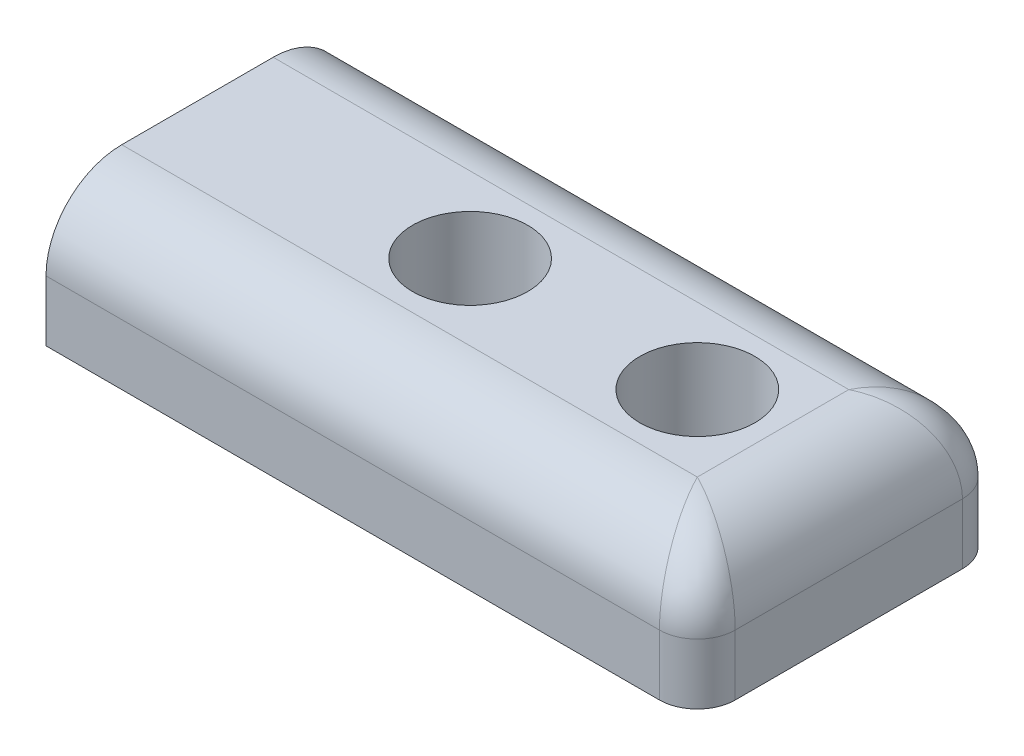
ISO-10303-21;
HEADER;
FILE_DESCRIPTION(('STEP AP214'),'2;1');
FILE_NAME('part.step','',(''),(''),'','','');
FILE_SCHEMA(('AUTOMOTIVE_DESIGN { 1 0 10303 214 1 1 1 1 }'));
ENDSEC;
DATA;
#1=APPLICATION_CONTEXT('core data for automotive mechanical design processes');
#2=APPLICATION_PROTOCOL_DEFINITION('international standard','automotive_design',2000,#1);
#3=PRODUCT_CONTEXT('',#1,'mechanical');
#4=PRODUCT('Part','Part','',(#3));
#5=PRODUCT_RELATED_PRODUCT_CATEGORY('part','',(#4));
#6=PRODUCT_DEFINITION_FORMATION('','',#4);
#7=PRODUCT_DEFINITION_CONTEXT('part definition',#1,'design');
#8=PRODUCT_DEFINITION('design','',#6,#7);
#9=PRODUCT_DEFINITION_SHAPE('','',#8);
#10=(LENGTH_UNIT() NAMED_UNIT(*) SI_UNIT(.MILLI.,.METRE.));
#11=(NAMED_UNIT(*) PLANE_ANGLE_UNIT() SI_UNIT($,.RADIAN.));
#12=(NAMED_UNIT(*) SI_UNIT($,.STERADIAN.) SOLID_ANGLE_UNIT());
#13=UNCERTAINTY_MEASURE_WITH_UNIT(LENGTH_MEASURE(1.E-05),#10,'distance_accuracy_value','');
#14=(GEOMETRIC_REPRESENTATION_CONTEXT(3) GLOBAL_UNCERTAINTY_ASSIGNED_CONTEXT((#13)) GLOBAL_UNIT_ASSIGNED_CONTEXT((#10,
#11,#12)) REPRESENTATION_CONTEXT('',''));
#15=CARTESIAN_POINT('',(0.,0.,0.));
#16=DIRECTION('',(0.,0.,1.));
#17=DIRECTION('',(1.,0.,0.));
#18=AXIS2_PLACEMENT_3D('',#15,#16,#17);
#19=CARTESIAN_POINT('',(10.75,4.5,-5.));
#20=DIRECTION('',(-1.,0.,0.));
#21=DIRECTION('',(0.,0.,1.));
#22=AXIS2_PLACEMENT_3D('',#19,#20,#21);
#23=PLANE('',#22);
#24=DIRECTION('',(0.,0.,-1.));
#25=VECTOR('',#24,1.);
#26=CARTESIAN_POINT('',(10.75,0.,-5.));
#27=LINE('',#26,#25);
#28=CARTESIAN_POINT('',(10.75,0.,3.75));
#29=VERTEX_POINT('',#28);
#30=CARTESIAN_POINT('',(10.75,0.,-3.75));
#31=VERTEX_POINT('',#30);
#32=EDGE_CURVE('E169',#29,#31,#27,.T.);
#33=ORIENTED_EDGE('',*,*,#32,.T.);
#34=DIRECTION('',(0.,-1.,0.));
#35=VECTOR('',#34,1.);
#36=CARTESIAN_POINT('',(10.75,4.5,-3.75));
#37=LINE('',#36,#35);
#38=CARTESIAN_POINT('',(10.75,2.,-3.75));
#39=VERTEX_POINT('',#38);
#40=EDGE_CURVE('E227',#31,#39,#37,.F.);
#41=ORIENTED_EDGE('',*,*,#40,.T.);
#42=DIRECTION('',(0.,0.,-1.));
#43=VECTOR('',#42,1.);
#44=CARTESIAN_POINT('',(10.75,2.,5.));
#45=LINE('',#44,#43);
#46=CARTESIAN_POINT('',(10.75,2.,3.75));
#47=VERTEX_POINT('',#46);
#48=EDGE_CURVE('E197',#39,#47,#45,.F.);
#49=ORIENTED_EDGE('',*,*,#48,.T.);
#50=DIRECTION('',(0.,-1.,0.));
#51=VECTOR('',#50,1.);
#52=CARTESIAN_POINT('',(10.75,4.5,3.75));
#53=LINE('',#52,#51);
#54=EDGE_CURVE('E223',#47,#29,#53,.T.);
#55=ORIENTED_EDGE('',*,*,#54,.T.);
#56=EDGE_LOOP('',(#33,#41,#49,#55));
#57=FACE_BOUND('',#56,.T.);
#58=ADVANCED_FACE('F47',(#57),#23,.F.);
#59=CARTESIAN_POINT('',(-10.75,4.5,-5.));
#60=DIRECTION('',(0.,0.,1.));
#61=DIRECTION('',(1.,0.,0.));
#62=AXIS2_PLACEMENT_3D('',#59,#60,#61);
#63=PLANE('',#62);
#64=DIRECTION('',(-1.,0.,0.));
#65=VECTOR('',#64,1.);
#66=CARTESIAN_POINT('',(10.75,2.,-5.));
#67=LINE('',#66,#65);
#68=CARTESIAN_POINT('',(-10.75,2.,-5.));
#69=VERTEX_POINT('',#68);
#70=CARTESIAN_POINT('',(9.5,2.,-5.));
#71=VERTEX_POINT('',#70);
#72=EDGE_CURVE('E206',#69,#71,#67,.F.);
#73=ORIENTED_EDGE('',*,*,#72,.T.);
#74=DIRECTION('',(0.,-1.,0.));
#75=VECTOR('',#74,1.);
#76=CARTESIAN_POINT('',(9.5,4.5,-5.));
#77=LINE('',#76,#75);
#78=CARTESIAN_POINT('',(9.5,0.,-5.));
#79=VERTEX_POINT('',#78);
#80=EDGE_CURVE('E213',#71,#79,#77,.T.);
#81=ORIENTED_EDGE('',*,*,#80,.T.);
#82=DIRECTION('',(-1.,0.,0.));
#83=VECTOR('',#82,1.);
#84=CARTESIAN_POINT('',(-10.75,0.,-5.));
#85=LINE('',#84,#83);
#86=CARTESIAN_POINT('',(-10.75,0.,-5.));
#87=VERTEX_POINT('',#86);
#88=EDGE_CURVE('E165',#79,#87,#85,.T.);
#89=ORIENTED_EDGE('',*,*,#88,.T.);
#90=DIRECTION('',(0.,-1.,0.));
#91=VECTOR('',#90,1.);
#92=CARTESIAN_POINT('',(-10.75,4.5,-5.));
#93=LINE('',#92,#91);
#94=EDGE_CURVE('E179',#69,#87,#93,.T.);
#95=ORIENTED_EDGE('',*,*,#94,.F.);
#96=EDGE_LOOP('',(#73,#81,#89,#95));
#97=FACE_BOUND('',#96,.T.);
#98=ADVANCED_FACE('F273',(#97),#63,.F.);
#99=CARTESIAN_POINT('',(-10.75,4.5,-5.));
#100=DIRECTION('',(1.,0.,0.));
#101=DIRECTION('',(0.,0.,-1.));
#102=AXIS2_PLACEMENT_3D('',#99,#100,#101);
#103=PLANE('',#102);
#104=DIRECTION('',(0.,0.,1.));
#105=VECTOR('',#104,1.);
#106=CARTESIAN_POINT('',(-10.75,4.5,-5.));
#107=LINE('',#106,#105);
#108=CARTESIAN_POINT('',(-10.75,4.5,-2.5));
#109=VERTEX_POINT('',#108);
#110=CARTESIAN_POINT('',(-10.75,4.5,2.5));
#111=VERTEX_POINT('',#110);
#112=EDGE_CURVE('E175',#109,#111,#107,.T.);
#113=ORIENTED_EDGE('',*,*,#112,.F.);
#114=CARTESIAN_POINT('',(-10.75,2.,-2.5));
#115=DIRECTION('',(1.,0.,0.));
#116=DIRECTION('',(0.,0.,-1.));
#117=AXIS2_PLACEMENT_3D('',#114,#115,#116);
#118=CIRCLE('',#117,2.5);
#119=EDGE_CURVE('E203',#109,#69,#118,.F.);
#120=ORIENTED_EDGE('',*,*,#119,.T.);
#121=ORIENTED_EDGE('',*,*,#94,.T.);
#122=DIRECTION('',(0.,0.,1.));
#123=VECTOR('',#122,1.);
#124=CARTESIAN_POINT('',(-10.75,0.,-5.));
#125=LINE('',#124,#123);
#126=CARTESIAN_POINT('',(-10.75,0.,-3.95));
#127=VERTEX_POINT('',#126);
#128=EDGE_CURVE('E157',#87,#127,#125,.T.);
#129=ORIENTED_EDGE('',*,*,#128,.T.);
#130=CARTESIAN_POINT('',(-10.75,0.,0.));
#131=DIRECTION('',(-1.,0.,0.));
#132=DIRECTION('',(0.,0.,1.));
#133=AXIS2_PLACEMENT_3D('',#130,#131,#132);
#134=CIRCLE('',#133,3.95);
#135=CARTESIAN_POINT('',(-10.75,0.,3.95));
#136=VERTEX_POINT('',#135);
#137=EDGE_CURVE('E137',#136,#127,#134,.T.);
#138=ORIENTED_EDGE('',*,*,#137,.F.);
#139=CARTESIAN_POINT('',(-10.75,0.,5.));
#140=VERTEX_POINT('',#139);
#141=EDGE_CURVE('E153',#136,#140,#125,.T.);
#142=ORIENTED_EDGE('',*,*,#141,.T.);
#143=DIRECTION('',(0.,-1.,0.));
#144=VECTOR('',#143,1.);
#145=CARTESIAN_POINT('',(-10.75,4.5,5.));
#146=LINE('',#145,#144);
#147=CARTESIAN_POINT('',(-10.75,2.,5.));
#148=VERTEX_POINT('',#147);
#149=EDGE_CURVE('E176',#148,#140,#146,.T.);
#150=ORIENTED_EDGE('',*,*,#149,.F.);
#151=CARTESIAN_POINT('',(-10.75,2.,2.5));
#152=DIRECTION('',(1.,0.,0.));
#153=DIRECTION('',(0.,0.,-1.));
#154=AXIS2_PLACEMENT_3D('',#151,#152,#153);
#155=CIRCLE('',#154,2.5);
#156=EDGE_CURVE('E200',#148,#111,#155,.F.);
#157=ORIENTED_EDGE('',*,*,#156,.T.);
#158=EDGE_LOOP('',(#113,#120,#121,#129,#138,#142,#150,#157));
#159=FACE_BOUND('',#158,.T.);
#160=ADVANCED_FACE('F151',(#159),#103,.F.);
#161=CARTESIAN_POINT('',(-10.75,4.5,5.));
#162=DIRECTION('',(0.,0.,-1.));
#163=DIRECTION('',(-1.,0.,0.));
#164=AXIS2_PLACEMENT_3D('',#161,#162,#163);
#165=PLANE('',#164);
#166=DIRECTION('',(1.,0.,0.));
#167=VECTOR('',#166,1.);
#168=CARTESIAN_POINT('',(-10.75,0.,5.));
#169=LINE('',#168,#167);
#170=CARTESIAN_POINT('',(9.5,0.,5.));
#171=VERTEX_POINT('',#170);
#172=EDGE_CURVE('E163',#140,#171,#169,.T.);
#173=ORIENTED_EDGE('',*,*,#172,.T.);
#174=DIRECTION('',(0.,-1.,0.));
#175=VECTOR('',#174,1.);
#176=CARTESIAN_POINT('',(9.5,4.5,5.));
#177=LINE('',#176,#175);
#178=CARTESIAN_POINT('',(9.5,2.,5.));
#179=VERTEX_POINT('',#178);
#180=EDGE_CURVE('E69',#171,#179,#177,.F.);
#181=ORIENTED_EDGE('',*,*,#180,.T.);
#182=DIRECTION('',(1.,0.,0.));
#183=VECTOR('',#182,1.);
#184=CARTESIAN_POINT('',(-10.75,2.,5.));
#185=LINE('',#184,#183);
#186=EDGE_CURVE('E210',#179,#148,#185,.F.);
#187=ORIENTED_EDGE('',*,*,#186,.T.);
#188=ORIENTED_EDGE('',*,*,#149,.T.);
#189=EDGE_LOOP('',(#173,#181,#187,#188));
#190=FACE_BOUND('',#189,.T.);
#191=ADVANCED_FACE('F284',(#190),#165,.F.);
#192=CARTESIAN_POINT('',(0.,4.5,0.));
#193=DIRECTION('',(0.,1.,0.));
#194=DIRECTION('',(0.,0.,1.));
#195=AXIS2_PLACEMENT_3D('',#192,#193,#194);
#196=PLANE('',#195);
#197=CARTESIAN_POINT('',(-1.75,4.5,0.));
#198=DIRECTION('',(0.,1.,0.));
#199=DIRECTION('',(0.,0.,1.));
#200=AXIS2_PLACEMENT_3D('',#197,#198,#199);
#201=CIRCLE('',#200,1.9);
#202=CARTESIAN_POINT('',(-1.75,4.5,1.9));
#203=VERTEX_POINT('',#202);
#204=EDGE_CURVE('E420',#203,#203,#201,.T.);
#205=ORIENTED_EDGE('',*,*,#204,.F.);
#206=EDGE_LOOP('',(#205));
#207=FACE_BOUND('',#206,.T.);
#208=CARTESIAN_POINT('',(5.75,4.5,0.));
#209=DIRECTION('',(0.,1.,0.));
#210=DIRECTION('',(0.,0.,1.));
#211=AXIS2_PLACEMENT_3D('',#208,#209,#210);
#212=CIRCLE('',#211,1.9);
#213=CARTESIAN_POINT('',(5.75,4.5,1.9));
#214=VERTEX_POINT('',#213);
#215=EDGE_CURVE('E416',#214,#214,#212,.T.);
#216=ORIENTED_EDGE('',*,*,#215,.F.);
#217=EDGE_LOOP('',(#216));
#218=FACE_BOUND('',#217,.T.);
#219=DIRECTION('',(0.,0.,-1.));
#220=VECTOR('',#219,1.);
#221=CARTESIAN_POINT('',(8.25,4.5,-5.));
#222=LINE('',#221,#220);
#223=CARTESIAN_POINT('',(8.25,4.5,2.5));
#224=VERTEX_POINT('',#223);
#225=CARTESIAN_POINT('',(8.25,4.5,-2.5));
#226=VERTEX_POINT('',#225);
#227=EDGE_CURVE('E190',#224,#226,#222,.T.);
#228=ORIENTED_EDGE('',*,*,#227,.T.);
#229=DIRECTION('',(-1.,0.,0.));
#230=VECTOR('',#229,1.);
#231=CARTESIAN_POINT('',(-10.75,4.5,-2.5));
#232=LINE('',#231,#230);
#233=EDGE_CURVE('E194',#226,#109,#232,.T.);
#234=ORIENTED_EDGE('',*,*,#233,.T.);
#235=ORIENTED_EDGE('',*,*,#112,.T.);
#236=DIRECTION('',(1.,0.,0.));
#237=VECTOR('',#236,1.);
#238=CARTESIAN_POINT('',(10.75,4.5,2.5));
#239=LINE('',#238,#237);
#240=EDGE_CURVE('E186',#111,#224,#239,.T.);
#241=ORIENTED_EDGE('',*,*,#240,.T.);
#242=EDGE_LOOP('',(#228,#234,#235,#241));
#243=FACE_BOUND('',#242,.T.);
#244=ADVANCED_FACE('F287',(#207,#218,#243),#196,.T.);
#245=CARTESIAN_POINT('',(0.,0.,0.));
#246=DIRECTION('',(0.,1.,0.));
#247=DIRECTION('',(0.,0.,1.));
#248=AXIS2_PLACEMENT_3D('',#245,#246,#247);
#249=PLANE('',#248);
#250=CARTESIAN_POINT('',(-1.75,0.,0.));
#251=DIRECTION('',(0.,1.,0.));
#252=DIRECTION('',(0.,0.,1.));
#253=AXIS2_PLACEMENT_3D('',#250,#251,#252);
#254=CIRCLE('',#253,1.9);
#255=CARTESIAN_POINT('',(-1.75,0.,1.9));
#256=VERTEX_POINT('',#255);
#257=EDGE_CURVE('E424',#256,#256,#254,.T.);
#258=ORIENTED_EDGE('',*,*,#257,.T.);
#259=EDGE_LOOP('',(#258));
#260=FACE_BOUND('',#259,.T.);
#261=CARTESIAN_POINT('',(5.75,0.,0.));
#262=DIRECTION('',(0.,1.,0.));
#263=DIRECTION('',(0.,0.,1.));
#264=AXIS2_PLACEMENT_3D('',#261,#262,#263);
#265=CIRCLE('',#264,1.9);
#266=CARTESIAN_POINT('',(5.75,0.,1.9));
#267=VERTEX_POINT('',#266);
#268=EDGE_CURVE('E412',#267,#267,#265,.T.);
#269=ORIENTED_EDGE('',*,*,#268,.T.);
#270=EDGE_LOOP('',(#269));
#271=FACE_BOUND('',#270,.T.);
#272=ORIENTED_EDGE('',*,*,#88,.F.);
#273=CARTESIAN_POINT('',(9.5,0.,-3.75));
#274=DIRECTION('',(0.,1.,0.));
#275=DIRECTION('',(0.,0.,1.));
#276=AXIS2_PLACEMENT_3D('',#273,#274,#275);
#277=CIRCLE('',#276,1.25);
#278=EDGE_CURVE('E220',#79,#31,#277,.F.);
#279=ORIENTED_EDGE('',*,*,#278,.T.);
#280=ORIENTED_EDGE('',*,*,#32,.F.);
#281=CARTESIAN_POINT('',(9.5,0.,3.75));
#282=DIRECTION('',(0.,1.,0.));
#283=DIRECTION('',(0.,0.,1.));
#284=AXIS2_PLACEMENT_3D('',#281,#282,#283);
#285=CIRCLE('',#284,1.25);
#286=EDGE_CURVE('E217',#29,#171,#285,.F.);
#287=ORIENTED_EDGE('',*,*,#286,.T.);
#288=ORIENTED_EDGE('',*,*,#172,.F.);
#289=ORIENTED_EDGE('',*,*,#141,.F.);
#290=DIRECTION('',(-1.,0.,0.));
#291=VECTOR('',#290,1.);
#292=CARTESIAN_POINT('',(-6.65,0.,3.95));
#293=LINE('',#292,#291);
#294=CARTESIAN_POINT('',(-6.65,0.,3.95));
#295=VERTEX_POINT('',#294);
#296=EDGE_CURVE('E133',#136,#295,#293,.F.);
#297=ORIENTED_EDGE('',*,*,#296,.T.);
#298=DIRECTION('',(0.,0.,1.));
#299=VECTOR('',#298,1.);
#300=CARTESIAN_POINT('',(-6.65,0.,0.));
#301=LINE('',#300,#299);
#302=CARTESIAN_POINT('',(-6.65,0.,-3.95));
#303=VERTEX_POINT('',#302);
#304=EDGE_CURVE('E145',#303,#295,#301,.T.);
#305=ORIENTED_EDGE('',*,*,#304,.F.);
#306=DIRECTION('',(-1.,0.,0.));
#307=VECTOR('',#306,1.);
#308=CARTESIAN_POINT('',(-6.65,0.,-3.95));
#309=LINE('',#308,#307);
#310=EDGE_CURVE('E144',#303,#127,#309,.T.);
#311=ORIENTED_EDGE('',*,*,#310,.T.);
#312=ORIENTED_EDGE('',*,*,#128,.F.);
#313=EDGE_LOOP('',(#272,#279,#280,#287,#288,#289,#297,#305,#311,#312));
#314=FACE_BOUND('',#313,.T.);
#315=ADVANCED_FACE('F162',(#260,#271,#314),#249,.F.);
#316=CARTESIAN_POINT('',(5.75,0.,0.));
#317=DIRECTION('',(0.,1.,0.));
#318=DIRECTION('',(0.,0.,1.));
#319=AXIS2_PLACEMENT_3D('',#316,#317,#318);
#320=CYLINDRICAL_SURFACE('',#319,1.9);
#321=ORIENTED_EDGE('',*,*,#268,.F.);
#322=EDGE_LOOP('',(#321));
#323=FACE_BOUND('',#322,.T.);
#324=ORIENTED_EDGE('',*,*,#215,.T.);
#325=EDGE_LOOP('',(#324));
#326=FACE_BOUND('',#325,.T.);
#327=ADVANCED_FACE('F289',(#323,#326),#320,.F.);
#328=CARTESIAN_POINT('',(-1.75,0.,0.));
#329=DIRECTION('',(0.,1.,0.));
#330=DIRECTION('',(0.,0.,1.));
#331=AXIS2_PLACEMENT_3D('',#328,#329,#330);
#332=CYLINDRICAL_SURFACE('',#331,1.9);
#333=ORIENTED_EDGE('',*,*,#257,.F.);
#334=EDGE_LOOP('',(#333));
#335=FACE_BOUND('',#334,.T.);
#336=ORIENTED_EDGE('',*,*,#204,.T.);
#337=EDGE_LOOP('',(#336));
#338=FACE_BOUND('',#337,.T.);
#339=ADVANCED_FACE('F296',(#335,#338),#332,.F.);
#340=CARTESIAN_POINT('',(-6.65,0.,0.));
#341=DIRECTION('',(-1.,0.,0.));
#342=DIRECTION('',(0.,0.,1.));
#343=AXIS2_PLACEMENT_3D('',#340,#341,#342);
#344=CYLINDRICAL_SURFACE('',#343,3.95);
#345=CARTESIAN_POINT('',(-6.65,0.,0.));
#346=DIRECTION('',(-1.,0.,0.));
#347=DIRECTION('',(0.,0.,1.));
#348=AXIS2_PLACEMENT_3D('',#345,#346,#347);
#349=CIRCLE('',#348,3.95);
#350=EDGE_CURVE('E139',#295,#303,#349,.T.);
#351=ORIENTED_EDGE('',*,*,#350,.F.);
#352=ORIENTED_EDGE('',*,*,#296,.F.);
#353=ORIENTED_EDGE('',*,*,#137,.T.);
#354=ORIENTED_EDGE('',*,*,#310,.F.);
#355=EDGE_LOOP('',(#351,#352,#353,#354));
#356=FACE_BOUND('',#355,.T.);
#357=ADVANCED_FACE('F135',(#356),#344,.F.);
#358=CARTESIAN_POINT('',(-6.65,0.,0.));
#359=DIRECTION('',(-1.,0.,0.));
#360=DIRECTION('',(0.,0.,1.));
#361=AXIS2_PLACEMENT_3D('',#358,#359,#360);
#362=PLANE('',#361);
#363=ORIENTED_EDGE('',*,*,#304,.T.);
#364=ORIENTED_EDGE('',*,*,#350,.T.);
#365=EDGE_LOOP('',(#363,#364));
#366=FACE_BOUND('',#365,.T.);
#367=ADVANCED_FACE('F264',(#366),#362,.T.);
#368=CARTESIAN_POINT('',(0.,2.,2.5));
#369=DIRECTION('',(-1.,0.,0.));
#370=DIRECTION('',(0.,0.,1.));
#371=AXIS2_PLACEMENT_3D('',#368,#369,#370);
#372=CYLINDRICAL_SURFACE('',#371,2.5);
#373=ORIENTED_EDGE('',*,*,#186,.F.);
#374=CARTESIAN_POINT('',(8.25,2.,2.5));
#375=DIRECTION('',(0.894427190999916,0.,-0.447213595499958));
#376=DIRECTION('',(0.447213595499958,0.,0.894427190999916));
#377=AXIS2_PLACEMENT_3D('',#374,#375,#376);
#378=ELLIPSE('',#377,2.79508497187474,2.5);
#379=EDGE_CURVE('E11',#179,#224,#378,.F.);
#380=ORIENTED_EDGE('',*,*,#379,.T.);
#381=ORIENTED_EDGE('',*,*,#240,.F.);
#382=ORIENTED_EDGE('',*,*,#156,.F.);
#383=EDGE_LOOP('',(#373,#380,#381,#382));
#384=FACE_BOUND('',#383,.T.);
#385=ADVANCED_FACE('F260',(#384),#372,.T.);
#386=CARTESIAN_POINT('',(0.,2.,-2.5));
#387=DIRECTION('',(1.,0.,0.));
#388=DIRECTION('',(0.,0.,-1.));
#389=AXIS2_PLACEMENT_3D('',#386,#387,#388);
#390=CYLINDRICAL_SURFACE('',#389,2.5);
#391=ORIENTED_EDGE('',*,*,#233,.F.);
#392=CARTESIAN_POINT('',(8.25,2.,-2.5));
#393=DIRECTION('',(-0.894427190999916,0.,-0.447213595499958));
#394=DIRECTION('',(-0.447213595499958,0.,0.894427190999916));
#395=AXIS2_PLACEMENT_3D('',#392,#393,#394);
#396=ELLIPSE('',#395,2.79508497187474,2.5);
#397=EDGE_CURVE('E61',#226,#71,#396,.T.);
#398=ORIENTED_EDGE('',*,*,#397,.T.);
#399=ORIENTED_EDGE('',*,*,#72,.F.);
#400=ORIENTED_EDGE('',*,*,#119,.F.);
#401=EDGE_LOOP('',(#391,#398,#399,#400));
#402=FACE_BOUND('',#401,.T.);
#403=ADVANCED_FACE('F257',(#402),#390,.T.);
#404=CARTESIAN_POINT('',(8.25,2.,0.));
#405=DIRECTION('',(0.,0.,1.));
#406=DIRECTION('',(1.,0.,0.));
#407=AXIS2_PLACEMENT_3D('',#404,#405,#406);
#408=CYLINDRICAL_SURFACE('',#407,2.5);
#409=ORIENTED_EDGE('',*,*,#48,.F.);
#410=CARTESIAN_POINT('',(8.25,2.,-2.5));
#411=DIRECTION('',(-0.447213595499958,0.,-0.894427190999916));
#412=DIRECTION('',(-0.894427190999916,0.,0.447213595499958));
#413=AXIS2_PLACEMENT_3D('',#410,#411,#412);
#414=ELLIPSE('',#413,2.79508497187474,2.5);
#415=EDGE_CURVE('E234',#39,#226,#414,.F.);
#416=ORIENTED_EDGE('',*,*,#415,.T.);
#417=ORIENTED_EDGE('',*,*,#227,.F.);
#418=CARTESIAN_POINT('',(8.25,2.,2.5));
#419=DIRECTION('',(0.447213595499958,0.,-0.894427190999916));
#420=DIRECTION('',(0.894427190999916,0.,0.447213595499958));
#421=AXIS2_PLACEMENT_3D('',#418,#419,#420);
#422=ELLIPSE('',#421,2.79508497187474,2.5);
#423=EDGE_CURVE('E77',#224,#47,#422,.T.);
#424=ORIENTED_EDGE('',*,*,#423,.T.);
#425=EDGE_LOOP('',(#409,#416,#417,#424));
#426=FACE_BOUND('',#425,.T.);
#427=ADVANCED_FACE('F252',(#426),#408,.T.);
#428=CARTESIAN_POINT('',(8.25,-0.5,-2.5));
#429=CARTESIAN_POINT('',(8.25,-0.5,-2.5));
#430=CARTESIAN_POINT('',(8.25,-0.5,-2.5));
#431=CARTESIAN_POINT('',(8.30445593387974,-0.499956180937483,-2.60891186775949));
#432=CARTESIAN_POINT('',(8.33169932417916,-0.499971633795231,-2.58169932417916));
#433=CARTESIAN_POINT('',(8.35891186775949,-0.499956180937482,-2.55445593387974));
#434=CARTESIAN_POINT('',(8.35892577223853,-0.492879390711457,-2.71785154447707));
#435=CARTESIAN_POINT('',(8.41362492956338,-0.49643279621389,-2.66362492956338));
#436=CARTESIAN_POINT('',(8.46785154447707,-0.492879390711457,-2.60892577223853));
#437=CARTESIAN_POINT('',(8.46692874242023,-0.464466186138877,-2.93385748484046));
#438=CARTESIAN_POINT('',(8.57701759048618,-0.48210746818504,-2.82701759048618));
#439=CARTESIAN_POINT('',(8.68385748484046,-0.464466186138877,-2.71692874242023));
#440=CARTESIAN_POINT('',(8.52046590080171,-0.44325148834774,-3.04093180160343));
#441=CARTESIAN_POINT('',(8.65894806211635,-0.471301059765046,-2.90894806211635));
#442=CARTESIAN_POINT('',(8.79093180160343,-0.44325148834774,-2.77046590080171));
#443=CARTESIAN_POINT('',(8.62569177412273,-0.386854614304637,-3.25138354824547));
#444=CARTESIAN_POINT('',(8.82237361965901,-0.44209433172581,-3.07237361965901));
#445=CARTESIAN_POINT('',(9.00138354824547,-0.386854614304636,-2.87569177412274));
#446=CARTESIAN_POINT('',(8.67739643120403,-0.351912682305615,-3.35479286240807));
#447=CARTESIAN_POINT('',(8.90432614054108,-0.423655382726429,-3.15432614054108));
#448=CARTESIAN_POINT('',(9.10479286240807,-0.351912682305614,-2.92739643120403));
#449=CARTESIAN_POINT('',(8.77805683373335,-0.268524892883583,-3.55611366746671));
#450=CARTESIAN_POINT('',(9.06785074699877,-0.37841643175925,-3.31785074699877));
#451=CARTESIAN_POINT('',(9.30611366746671,-0.268524892883582,-3.02805683373336));
#452=CARTESIAN_POINT('',(8.82704891980832,-0.220432901107066,-3.65409783961664));
#453=CARTESIAN_POINT('',(9.14986429227303,-0.351564233128582,-3.39986429227303));
#454=CARTESIAN_POINT('',(9.40409783961664,-0.220432901107066,-3.07704891980832));
#455=CARTESIAN_POINT('',(8.92142479417494,-0.111456529170347,-3.84284958834987));
#456=CARTESIAN_POINT('',(9.31353936797959,-0.288199051327867,-3.56353936797959));
#457=CARTESIAN_POINT('',(9.59284958834987,-0.111456529170346,-3.17142479417494));
#458=CARTESIAN_POINT('',(8.96687379833891,-0.051028056117229,-3.93374759667782));
#459=CARTESIAN_POINT('',(9.39561231770866,-0.251631389224831,-3.64561231770866));
#460=CARTESIAN_POINT('',(9.68374759667782,-0.0510280561172274,-3.21687379833891));
#461=CARTESIAN_POINT('',(9.05335509580684,0.0816912934874319,-4.10671019161367));
#462=CARTESIAN_POINT('',(9.55925810726242,-0.166779927152644,-3.80925810726242));
#463=CARTESIAN_POINT('',(9.85671019161367,0.0816912934874333,-3.30335509580684));
#464=CARTESIAN_POINT('',(9.09448958953204,0.15344424644474,-4.18897917906409));
#465=CARTESIAN_POINT('',(9.64118996564893,-0.11846253387828,-3.89118996564893));
#466=CARTESIAN_POINT('',(9.93897917906409,0.15344424644474,-3.34448958953204));
#467=CARTESIAN_POINT('',(9.17159910034432,0.307665277703491,-4.34319820068864));
#468=CARTESIAN_POINT('',(9.80391164676731,-0.00713205513862803,-4.05391164676731));
#469=CARTESIAN_POINT('',(10.0931982006886,0.307665277703491,-3.42159910034432));
#470=CARTESIAN_POINT('',(9.20771926540998,0.389546641603582,-4.41543853081997));
#471=CARTESIAN_POINT('',(9.88497757651562,0.0558491217687662,-4.13497757651562));
#472=CARTESIAN_POINT('',(10.16543853082,0.389546641603583,-3.45771926540999));
#473=CARTESIAN_POINT('',(9.27413709166401,0.562666072959942,-4.54827418332802));
#474=CARTESIAN_POINT('',(10.0442931240796,0.200346345721282,-4.29429312407963));
#475=CARTESIAN_POINT('',(10.298274183328,0.562666072959944,-3.52413709166401));
#476=CARTESIAN_POINT('',(9.30462348850139,0.653318147654521,-4.60924697700278));
#477=CARTESIAN_POINT('',(10.1227009617604,0.281689197910976,-4.37270096176039));
#478=CARTESIAN_POINT('',(10.3592469770028,0.653318147654522,-3.55462348850139));
#479=CARTESIAN_POINT('',(9.35920747679134,0.842411982898301,-4.71841495358267));
#480=CARTESIAN_POINT('',(10.2732897090255,0.466928603444963,-4.52328970902553));
#481=CARTESIAN_POINT('',(10.4684149535827,0.842411982898302,-3.60920747679134));
#482=CARTESIAN_POINT('',(9.38352776144434,0.940332904635576,-4.76705552288868));
#483=CARTESIAN_POINT('',(10.3454841995717,0.570397720829993,-4.59548419957169));
#484=CARTESIAN_POINT('',(10.5170555228887,0.940332904635577,-3.63352776144434));
#485=CARTESIAN_POINT('',(9.42533157969453,1.14219618344742,-4.85066315938906));
#486=CARTESIAN_POINT('',(10.4779971962076,0.802361669332824,-4.72799719620756));
#487=CARTESIAN_POINT('',(10.6006631593891,1.14219618344742,-3.67533157969453));
#488=CARTESIAN_POINT('',(9.44304659288318,1.24574966302615,-4.88609318576637));
#489=CARTESIAN_POINT('',(10.5381907237899,0.930040324117443,-4.78819072378994));
#490=CARTESIAN_POINT('',(10.6360931857664,1.24574966302615,-3.69304659288318));
#491=CARTESIAN_POINT('',(9.47133677180838,1.45693619055351,-4.94267354361676));
#492=CARTESIAN_POINT('',(10.6393262696795,1.20866853883658,-4.88932626967951));
#493=CARTESIAN_POINT('',(10.6926735436168,1.45693619055351,-3.72133677180838));
#494=CARTESIAN_POINT('',(9.48211035038742,1.56435338065055,-4.96422070077484));
#495=CARTESIAN_POINT('',(10.680070581323,1.35831896876683,-4.93007058132305));
#496=CARTESIAN_POINT('',(10.7142207007748,1.56435338065055,-3.73211035038742));
#497=CARTESIAN_POINT('',(9.49638374561597,1.78122190556899,-4.99276749123193));
#498=CARTESIAN_POINT('',(10.7354827430434,1.67281564976531,-4.98548274304339));
#499=CARTESIAN_POINT('',(10.7427674912319,1.78122190556899,-3.74638374561597));
#500=CARTESIAN_POINT('',(9.5,1.8906109527845,-5.));
#501=CARTESIAN_POINT('',(10.75,1.83593044725813,-5.));
#502=CARTESIAN_POINT('',(10.75,1.8906109527845,-3.75));
#503=CARTESIAN_POINT('',(9.5,2.1093890472155,-5.));
#504=CARTESIAN_POINT('',(10.75,2.16406955274187,-5.));
#505=CARTESIAN_POINT('',(10.75,2.1093890472155,-3.75));
#506=CARTESIAN_POINT('',(9.49638374561597,2.21877809443101,-4.99276749123193));
#507=CARTESIAN_POINT('',(10.7354827430434,2.32718435023469,-4.98548274304339));
#508=CARTESIAN_POINT('',(10.7427674912319,2.21877809443101,-3.74638374561597));
#509=CARTESIAN_POINT('',(9.48211035038742,2.43564661934945,-4.96422070077484));
#510=CARTESIAN_POINT('',(10.680070581323,2.64168103123316,-4.93007058132304));
#511=CARTESIAN_POINT('',(10.7142207007748,2.43564661934945,-3.73211035038742));
#512=CARTESIAN_POINT('',(9.47133677180838,2.54306380944649,-4.94267354361676));
#513=CARTESIAN_POINT('',(10.6393262696795,2.79133146116342,-4.88932626967951));
#514=CARTESIAN_POINT('',(10.6926735436168,2.54306380944649,-3.72133677180838));
#515=CARTESIAN_POINT('',(9.44304659288318,2.75425033697385,-4.88609318576637));
#516=CARTESIAN_POINT('',(10.5381907237899,3.06995967588256,-4.78819072378994));
#517=CARTESIAN_POINT('',(10.6360931857664,2.75425033697385,-3.69304659288318));
#518=CARTESIAN_POINT('',(9.42533157969453,2.85780381655258,-4.85066315938906));
#519=CARTESIAN_POINT('',(10.4779971962076,3.19763833066717,-4.72799719620756));
#520=CARTESIAN_POINT('',(10.6006631593891,2.85780381655258,-3.67533157969453));
#521=CARTESIAN_POINT('',(9.38352776144434,3.05966709536442,-4.76705552288868));
#522=CARTESIAN_POINT('',(10.3454841995717,3.42960227917001,-4.5954841995717));
#523=CARTESIAN_POINT('',(10.5170555228887,3.05966709536442,-3.63352776144434));
#524=CARTESIAN_POINT('',(9.35920747679134,3.1575880171017,-4.71841495358267));
#525=CARTESIAN_POINT('',(10.2732897090255,3.53307139655504,-4.52328970902552));
#526=CARTESIAN_POINT('',(10.4684149535827,3.1575880171017,-3.60920747679134));
#527=CARTESIAN_POINT('',(9.30462348850139,3.34668185234548,-4.60924697700278));
#528=CARTESIAN_POINT('',(10.1227009617604,3.71831080208902,-4.37270096176039));
#529=CARTESIAN_POINT('',(10.3592469770028,3.34668185234548,-3.55462348850139));
#530=CARTESIAN_POINT('',(9.27413709166401,3.43733392704006,-4.54827418332803));
#531=CARTESIAN_POINT('',(10.0442931240796,3.79965365427872,-4.29429312407963));
#532=CARTESIAN_POINT('',(10.298274183328,3.43733392704006,-3.52413709166401));
#533=CARTESIAN_POINT('',(9.20771926540998,3.61045335839642,-4.41543853081998));
#534=CARTESIAN_POINT('',(9.88497757651562,3.94415087823123,-4.13497757651562));
#535=CARTESIAN_POINT('',(10.16543853082,3.61045335839641,-3.45771926540999));
#536=CARTESIAN_POINT('',(9.17159910034432,3.69233472229651,-4.34319820068864));
#537=CARTESIAN_POINT('',(9.80391164676731,4.00713205513863,-4.05391164676731));
#538=CARTESIAN_POINT('',(10.0931982006886,3.69233472229651,-3.42159910034432));
#539=CARTESIAN_POINT('',(9.09448958953204,3.84655575355526,-4.18897917906409));
#540=CARTESIAN_POINT('',(9.64118996564894,4.11846253387828,-3.89118996564893));
#541=CARTESIAN_POINT('',(9.93897917906409,3.84655575355526,-3.34448958953204));
#542=CARTESIAN_POINT('',(9.05335509580684,3.91830870651257,-4.10671019161367));
#543=CARTESIAN_POINT('',(9.55925810726242,4.16677992715264,-3.80925810726242));
#544=CARTESIAN_POINT('',(9.85671019161367,3.91830870651257,-3.30335509580684));
#545=CARTESIAN_POINT('',(8.96687379833891,4.05102805611723,-3.93374759667783));
#546=CARTESIAN_POINT('',(9.39561231770866,4.25163138922483,-3.64561231770866));
#547=CARTESIAN_POINT('',(9.68374759667783,4.05102805611723,-3.21687379833891));
#548=CARTESIAN_POINT('',(8.92142479417494,4.11145652917034,-3.84284958834988));
#549=CARTESIAN_POINT('',(9.31353936797959,4.28819905132787,-3.56353936797959));
#550=CARTESIAN_POINT('',(9.59284958834987,4.11145652917034,-3.17142479417494));
#551=CARTESIAN_POINT('',(8.82704891980832,4.22043290110706,-3.65409783961664));
#552=CARTESIAN_POINT('',(9.14986429227303,4.35156423312858,-3.39986429227303));
#553=CARTESIAN_POINT('',(9.40409783961664,4.22043290110706,-3.07704891980832));
#554=CARTESIAN_POINT('',(8.77805683373336,4.26852489288358,-3.55611366746671));
#555=CARTESIAN_POINT('',(9.06785074699877,4.37841643175925,-3.31785074699877));
#556=CARTESIAN_POINT('',(9.30611366746671,4.26852489288358,-3.02805683373336));
#557=CARTESIAN_POINT('',(8.67739643120403,4.35191268230561,-3.35479286240807));
#558=CARTESIAN_POINT('',(8.90432614054108,4.42365538272643,-3.15432614054108));
#559=CARTESIAN_POINT('',(9.10479286240807,4.35191268230561,-2.92739643120403));
#560=CARTESIAN_POINT('',(8.62569177412273,4.38685461430464,-3.25138354824547));
#561=CARTESIAN_POINT('',(8.82237361965901,4.44209433172581,-3.07237361965901));
#562=CARTESIAN_POINT('',(9.00138354824547,4.38685461430464,-2.87569177412274));
#563=CARTESIAN_POINT('',(8.52046590080171,4.44325148834774,-3.04093180160343));
#564=CARTESIAN_POINT('',(8.65894806211635,4.47130105976505,-2.90894806211635));
#565=CARTESIAN_POINT('',(8.79093180160343,4.44325148834774,-2.77046590080171));
#566=CARTESIAN_POINT('',(8.46692874242023,4.46446618613888,-2.93385748484046));
#567=CARTESIAN_POINT('',(8.57701759048618,4.48210746818504,-2.82701759048618));
#568=CARTESIAN_POINT('',(8.68385748484046,4.46446618613888,-2.71692874242023));
#569=CARTESIAN_POINT('',(8.35892577223853,4.49287939071146,-2.71785154447707));
#570=CARTESIAN_POINT('',(8.41362492956338,4.49643279621389,-2.66362492956338));
#571=CARTESIAN_POINT('',(8.46785154447707,4.49287939071146,-2.60892577223853));
#572=CARTESIAN_POINT('',(8.30445593387974,4.49995618093748,-2.60891186775949));
#573=CARTESIAN_POINT('',(8.33169932417916,4.49997163379523,-2.58169932417916));
#574=CARTESIAN_POINT('',(8.35891186775949,4.49995618093748,-2.55445593387974));
#575=CARTESIAN_POINT('',(8.25,4.5,-2.5));
#576=CARTESIAN_POINT('',(8.25,4.5,-2.5));
#577=CARTESIAN_POINT('',(8.25,4.5,-2.5));
#578=(BOUNDED_SURFACE() B_SPLINE_SURFACE(3,2,((#428,#429,#430),(#431,#432,#433),(#434,#435,
#436),(#437,#438,#439),(#440,#441,#442),(#443,#444,#445),(#446,#447,#448),(#449,#450,#451),
(#452,#453,#454),(#455,#456,#457),(#458,#459,#460),(#461,#462,#463),(#464,#465,#466),(#467,#468,
#469),(#470,#471,#472),(#473,#474,#475),(#476,#477,#478),(#479,#480,#481),(#482,#483,#484),
(#485,#486,#487),(#488,#489,#490),(#491,#492,#493),(#494,#495,#496),(#497,#498,#499),(#500,#501,
#502),(#503,#504,#505),(#506,#507,#508),(#509,#510,#511),(#512,#513,#514),(#515,#516,#517),
(#518,#519,#520),(#521,#522,#523),(#524,#525,#526),(#527,#528,#529),(#530,#531,#532),(#533,#534,
#535),(#536,#537,#538),(#539,#540,#541),(#542,#543,#544),(#545,#546,#547),(#548,#549,#550),
(#551,#552,#553),(#554,#555,#556),(#557,#558,#559),(#560,#561,#562),(#563,#564,#565),(#566,#567,
#568),(#569,#570,#571),(#572,#573,#574),(#575,#576,#577)),.UNSPECIFIED.,.F.,.F.,
.F.) B_SPLINE_SURFACE_WITH_KNOTS((4,2,2,2,2,2,2,2,2,2,2,2,2,2,2,2,2,2,2,2,2,2,2,2,4),(3,3),(0.,
0.230987567670876,0.460011765877577,0.685194551646684,0.904830095979561,1.11747462658022,
1.32204004073361,1.51789053461294,1.70493793028087,1.88372454131796,2.05547184876059,
2.22206218838538,2.3859193463066,2.54977650422782,2.71636684385262,2.88811415129525,
3.06690076233234,3.25394815800027,3.4497986518796,3.65436406603299,3.86700859663364,
4.08664414096652,4.31182692673563,4.54085112494233,4.77183869261321),(0.,1.),
.UNSPECIFIED.) GEOMETRIC_REPRESENTATION_ITEM() RATIONAL_B_SPLINE_SURFACE(((1.,1.,1.),(1.,
1.00000566557019,1.),(1.,0.998576699090688,1.),(1.,0.992910721279765,1.),(1.,0.988697681267574,
1.),(1.,0.977617128833049,1.),(1.,0.970795325018433,1.),(1.,0.954789124900482,1.),(1.,
0.945667069465631,1.),(1.,0.925487968757329,1.),(1.,0.914501756375306,1.),(1.,0.891169998194024,
1.),(1.,0.878891956959708,1.),(1.,0.853706993048538,1.),(1.,0.84084914596985,1.),(1.,
0.815387454422431,1.),(1.,0.802798170091792,1.),(1.,0.778880732263429,1.),(1.,0.767521437046521,
1.),(1.,0.747118526989836,1.),(1.,0.738001346912332,1.),(1.,0.723039691293395,1.),(1.,
0.717105167896984,1.),(1.,0.709170186451793,1.),(1.,0.707106781186548,1.),(1.,0.707106781186548,
1.),(1.,0.709170186451793,1.),(1.,0.717105167896984,1.),(1.,0.723039691293395,1.),(1.,
0.738001346912332,1.),(1.,0.747118526989836,1.),(1.,0.767521437046521,1.),(1.,0.778880732263429,
1.),(1.,0.802798170091792,1.),(1.,0.815387454422431,1.),(1.,0.84084914596985,1.),(1.,
0.853706993048538,1.),(1.,0.878891956959708,1.),(1.,0.891169998194024,1.),(1.,0.914501756375306,
1.),(1.,0.925487968757329,1.),(1.,0.94566706946563,1.),(1.,0.954789124900482,1.),(1.,
0.970795325018432,1.),(1.,0.977617128833049,1.),(1.,0.988697681267574,1.),(1.,0.992910721279765,
1.),(1.,0.998576699090688,1.),(1.,1.00000566557019,1.),(1.,1.,1.))) REPRESENTATION_ITEM('') SURFACE());
#579=ORIENTED_EDGE('',*,*,#397,.F.);
#580=ORIENTED_EDGE('',*,*,#415,.F.);
#581=CARTESIAN_POINT('',(9.5,2.,-3.75));
#582=DIRECTION('',(0.,-1.,0.));
#583=DIRECTION('',(0.,0.,-1.));
#584=AXIS2_PLACEMENT_3D('',#581,#582,#583);
#585=CIRCLE('',#584,1.25);
#586=EDGE_CURVE('E159',#71,#39,#585,.T.);
#587=ORIENTED_EDGE('',*,*,#586,.F.);
#588=EDGE_LOOP('',(#579,#580,#587));
#589=FACE_BOUND('',#588,.T.);
#590=ADVANCED_FACE('F245',(#589),#578,.T.);
#591=CARTESIAN_POINT('',(9.5,4.5,-3.75));
#592=DIRECTION('',(0.,-1.,0.));
#593=DIRECTION('',(0.,0.,-1.));
#594=AXIS2_PLACEMENT_3D('',#591,#592,#593);
#595=CYLINDRICAL_SURFACE('',#594,1.25);
#596=ORIENTED_EDGE('',*,*,#586,.T.);
#597=ORIENTED_EDGE('',*,*,#40,.F.);
#598=ORIENTED_EDGE('',*,*,#278,.F.);
#599=ORIENTED_EDGE('',*,*,#80,.F.);
#600=EDGE_LOOP('',(#596,#597,#598,#599));
#601=FACE_BOUND('',#600,.T.);
#602=ADVANCED_FACE('F251',(#601),#595,.T.);
#603=CARTESIAN_POINT('',(8.25,-0.5,2.5));
#604=CARTESIAN_POINT('',(8.25,-0.5,2.5));
#605=CARTESIAN_POINT('',(8.25,-0.5,2.5));
#606=CARTESIAN_POINT('',(8.35891186775949,-0.499956180937483,2.55445593387975));
#607=CARTESIAN_POINT('',(8.33169932417916,-0.499971633795231,2.58169932417916));
#608=CARTESIAN_POINT('',(8.30445593387974,-0.499956180937483,2.60891186775949));
#609=CARTESIAN_POINT('',(8.46785154447707,-0.492879390711457,2.60892577223854));
#610=CARTESIAN_POINT('',(8.41362492956338,-0.49643279621389,2.66362492956338));
#611=CARTESIAN_POINT('',(8.35892577223854,-0.492879390711457,2.71785154447707));
#612=CARTESIAN_POINT('',(8.68385748484046,-0.464466186138877,2.71692874242023));
#613=CARTESIAN_POINT('',(8.57701759048618,-0.48210746818504,2.82701759048618));
#614=CARTESIAN_POINT('',(8.46692874242023,-0.464466186138877,2.93385748484046));
#615=CARTESIAN_POINT('',(8.79093180160343,-0.44325148834774,2.77046590080171));
#616=CARTESIAN_POINT('',(8.65894806211635,-0.471301059765047,2.90894806211635));
#617=CARTESIAN_POINT('',(8.52046590080171,-0.44325148834774,3.04093180160343));
#618=CARTESIAN_POINT('',(9.00138354824547,-0.386854614304636,2.87569177412274));
#619=CARTESIAN_POINT('',(8.82237361965901,-0.44209433172581,3.07237361965901));
#620=CARTESIAN_POINT('',(8.62569177412274,-0.386854614304637,3.25138354824547));
#621=CARTESIAN_POINT('',(9.10479286240807,-0.351912682305614,2.92739643120404));
#622=CARTESIAN_POINT('',(8.90432614054108,-0.423655382726429,3.15432614054108));
#623=CARTESIAN_POINT('',(8.67739643120403,-0.351912682305615,3.35479286240807));
#624=CARTESIAN_POINT('',(9.30611366746671,-0.268524892883582,3.02805683373336));
#625=CARTESIAN_POINT('',(9.06785074699878,-0.378416431759251,3.31785074699877));
#626=CARTESIAN_POINT('',(8.77805683373336,-0.268524892883583,3.55611366746671));
#627=CARTESIAN_POINT('',(9.40409783961664,-0.220432901107065,3.07704891980832));
#628=CARTESIAN_POINT('',(9.14986429227303,-0.351564233128582,3.39986429227303));
#629=CARTESIAN_POINT('',(8.82704891980832,-0.220432901107067,3.65409783961664));
#630=CARTESIAN_POINT('',(9.59284958834987,-0.111456529170346,3.17142479417494));
#631=CARTESIAN_POINT('',(9.31353936797959,-0.288199051327867,3.56353936797959));
#632=CARTESIAN_POINT('',(8.92142479417494,-0.111456529170347,3.84284958834988));
#633=CARTESIAN_POINT('',(9.68374759667782,-0.0510280561172287,3.21687379833891));
#634=CARTESIAN_POINT('',(9.39561231770866,-0.251631389224831,3.64561231770866));
#635=CARTESIAN_POINT('',(8.96687379833891,-0.0510280561172291,3.93374759667783));
#636=CARTESIAN_POINT('',(9.85671019161367,0.0816912934874315,3.30335509580684));
#637=CARTESIAN_POINT('',(9.55925810726242,-0.166779927152645,3.80925810726242));
#638=CARTESIAN_POINT('',(9.05335509580684,0.081691293487431,4.10671019161367));
#639=CARTESIAN_POINT('',(9.93897917906409,0.15344424644474,3.34448958953204));
#640=CARTESIAN_POINT('',(9.64118996564894,-0.118462533878281,3.89118996564893));
#641=CARTESIAN_POINT('',(9.09448958953204,0.153444246444739,4.18897917906409));
#642=CARTESIAN_POINT('',(10.0931982006886,0.307665277703491,3.42159910034432));
#643=CARTESIAN_POINT('',(9.80391164676731,-0.00713205513862861,4.05391164676731));
#644=CARTESIAN_POINT('',(9.17159910034432,0.30766527770349,4.34319820068864));
#645=CARTESIAN_POINT('',(10.16543853082,0.389546641603583,3.45771926540999));
#646=CARTESIAN_POINT('',(9.88497757651562,0.055849121768766,4.13497757651562));
#647=CARTESIAN_POINT('',(9.20771926540999,0.389546641603583,4.41543853081998));
#648=CARTESIAN_POINT('',(10.298274183328,0.562666072959943,3.52413709166401));
#649=CARTESIAN_POINT('',(10.0442931240796,0.200346345721281,4.29429312407963));
#650=CARTESIAN_POINT('',(9.27413709166401,0.562666072959942,4.54827418332803));
#651=CARTESIAN_POINT('',(10.3592469770028,0.65331814765452,3.55462348850139));
#652=CARTESIAN_POINT('',(10.1227009617604,0.281689197910975,4.37270096176039));
#653=CARTESIAN_POINT('',(9.30462348850139,0.65331814765452,4.60924697700278));
#654=CARTESIAN_POINT('',(10.4684149535827,0.842411982898301,3.60920747679134));
#655=CARTESIAN_POINT('',(10.2732897090255,0.466928603444962,4.52328970902553));
#656=CARTESIAN_POINT('',(9.35920747679134,0.8424119828983,4.71841495358268));
#657=CARTESIAN_POINT('',(10.5170555228887,0.940332904635578,3.63352776144434));
#658=CARTESIAN_POINT('',(10.3454841995717,0.570397720829993,4.5954841995717));
#659=CARTESIAN_POINT('',(9.38352776144434,0.940332904635576,4.76705552288868));
#660=CARTESIAN_POINT('',(10.6006631593891,1.14219618344742,3.67533157969453));
#661=CARTESIAN_POINT('',(10.4779971962076,0.802361669332824,4.72799719620756));
#662=CARTESIAN_POINT('',(9.42533157969453,1.14219618344742,4.85066315938906));
#663=CARTESIAN_POINT('',(10.6360931857664,1.24574966302615,3.69304659288318));
#664=CARTESIAN_POINT('',(10.5381907237899,0.930040324117441,4.78819072378994));
#665=CARTESIAN_POINT('',(9.44304659288318,1.24574966302615,4.88609318576637));
#666=CARTESIAN_POINT('',(10.6926735436168,1.45693619055351,3.72133677180838));
#667=CARTESIAN_POINT('',(10.6393262696795,1.20866853883657,4.88932626967951));
#668=CARTESIAN_POINT('',(9.47133677180838,1.45693619055351,4.94267354361676));
#669=CARTESIAN_POINT('',(10.7142207007748,1.56435338065055,3.73211035038742));
#670=CARTESIAN_POINT('',(10.680070581323,1.35831896876683,4.93007058132305));
#671=CARTESIAN_POINT('',(9.48211035038742,1.56435338065055,4.96422070077484));
#672=CARTESIAN_POINT('',(10.7427674912319,1.78122190556899,3.74638374561597));
#673=CARTESIAN_POINT('',(10.7354827430434,1.67281564976531,4.98548274304339));
#674=CARTESIAN_POINT('',(9.49638374561597,1.78122190556899,4.99276749123193));
#675=CARTESIAN_POINT('',(10.75,1.8906109527845,3.75));
#676=CARTESIAN_POINT('',(10.75,1.83593044725813,5.));
#677=CARTESIAN_POINT('',(9.5,1.8906109527845,5.));
#678=CARTESIAN_POINT('',(10.75,2.1093890472155,3.75));
#679=CARTESIAN_POINT('',(10.75,2.16406955274187,5.));
#680=CARTESIAN_POINT('',(9.5,2.1093890472155,5.));
#681=CARTESIAN_POINT('',(10.7427674912319,2.21877809443101,3.74638374561597));
#682=CARTESIAN_POINT('',(10.7354827430434,2.32718435023469,4.98548274304339));
#683=CARTESIAN_POINT('',(9.49638374561597,2.21877809443101,4.99276749123193));
#684=CARTESIAN_POINT('',(10.7142207007748,2.43564661934945,3.73211035038742));
#685=CARTESIAN_POINT('',(10.680070581323,2.64168103123316,4.93007058132305));
#686=CARTESIAN_POINT('',(9.48211035038742,2.43564661934945,4.96422070077484));
#687=CARTESIAN_POINT('',(10.6926735436168,2.54306380944649,3.72133677180838));
#688=CARTESIAN_POINT('',(10.6393262696795,2.79133146116342,4.88932626967951));
#689=CARTESIAN_POINT('',(9.47133677180838,2.54306380944649,4.94267354361676));
#690=CARTESIAN_POINT('',(10.6360931857664,2.75425033697385,3.69304659288318));
#691=CARTESIAN_POINT('',(10.5381907237899,3.06995967588256,4.78819072378994));
#692=CARTESIAN_POINT('',(9.44304659288318,2.75425033697385,4.88609318576637));
#693=CARTESIAN_POINT('',(10.6006631593891,2.85780381655258,3.67533157969453));
#694=CARTESIAN_POINT('',(10.4779971962076,3.19763833066717,4.72799719620756));
#695=CARTESIAN_POINT('',(9.42533157969453,2.85780381655258,4.85066315938906));
#696=CARTESIAN_POINT('',(10.5170555228887,3.05966709536442,3.63352776144434));
#697=CARTESIAN_POINT('',(10.3454841995717,3.42960227917001,4.5954841995717));
#698=CARTESIAN_POINT('',(9.38352776144434,3.05966709536442,4.76705552288868));
#699=CARTESIAN_POINT('',(10.4684149535827,3.1575880171017,3.60920747679134));
#700=CARTESIAN_POINT('',(10.2732897090255,3.53307139655504,4.52328970902553));
#701=CARTESIAN_POINT('',(9.35920747679134,3.1575880171017,4.71841495358268));
#702=CARTESIAN_POINT('',(10.3592469770028,3.34668185234548,3.55462348850139));
#703=CARTESIAN_POINT('',(10.1227009617604,3.71831080208902,4.37270096176039));
#704=CARTESIAN_POINT('',(9.30462348850139,3.34668185234548,4.60924697700278));
#705=CARTESIAN_POINT('',(10.298274183328,3.43733392704005,3.52413709166401));
#706=CARTESIAN_POINT('',(10.0442931240796,3.79965365427872,4.29429312407963));
#707=CARTESIAN_POINT('',(9.27413709166401,3.43733392704006,4.54827418332803));
#708=CARTESIAN_POINT('',(10.16543853082,3.61045335839642,3.45771926540999));
#709=CARTESIAN_POINT('',(9.88497757651562,3.94415087823123,4.13497757651562));
#710=CARTESIAN_POINT('',(9.20771926540999,3.61045335839642,4.41543853081998));
#711=CARTESIAN_POINT('',(10.0931982006886,3.69233472229651,3.42159910034432));
#712=CARTESIAN_POINT('',(9.80391164676731,4.00713205513863,4.05391164676731));
#713=CARTESIAN_POINT('',(9.17159910034432,3.69233472229651,4.34319820068865));
#714=CARTESIAN_POINT('',(9.93897917906409,3.84655575355526,3.34448958953204));
#715=CARTESIAN_POINT('',(9.64118996564894,4.11846253387828,3.89118996564894));
#716=CARTESIAN_POINT('',(9.09448958953204,3.84655575355526,4.18897917906409));
#717=CARTESIAN_POINT('',(9.85671019161367,3.91830870651257,3.30335509580684));
#718=CARTESIAN_POINT('',(9.55925810726242,4.16677992715264,3.80925810726242));
#719=CARTESIAN_POINT('',(9.05335509580684,3.91830870651257,4.10671019161367));
#720=CARTESIAN_POINT('',(9.68374759667783,4.05102805611723,3.21687379833891));
#721=CARTESIAN_POINT('',(9.39561231770866,4.25163138922483,3.64561231770867));
#722=CARTESIAN_POINT('',(8.96687379833891,4.05102805611723,3.93374759667783));
#723=CARTESIAN_POINT('',(9.59284958834988,4.11145652917034,3.17142479417494));
#724=CARTESIAN_POINT('',(9.31353936797959,4.28819905132787,3.56353936797959));
#725=CARTESIAN_POINT('',(8.92142479417494,4.11145652917035,3.84284958834988));
#726=CARTESIAN_POINT('',(9.40409783961664,4.22043290110706,3.07704891980832));
#727=CARTESIAN_POINT('',(9.14986429227303,4.35156423312858,3.39986429227303));
#728=CARTESIAN_POINT('',(8.82704891980832,4.22043290110707,3.65409783961664));
#729=CARTESIAN_POINT('',(9.30611366746671,4.26852489288358,3.02805683373336));
#730=CARTESIAN_POINT('',(9.06785074699877,4.37841643175925,3.31785074699877));
#731=CARTESIAN_POINT('',(8.77805683373336,4.26852489288358,3.55611366746671));
#732=CARTESIAN_POINT('',(9.10479286240807,4.35191268230561,2.92739643120404));
#733=CARTESIAN_POINT('',(8.90432614054108,4.42365538272643,3.15432614054108));
#734=CARTESIAN_POINT('',(8.67739643120403,4.35191268230561,3.35479286240807));
#735=CARTESIAN_POINT('',(9.00138354824547,4.38685461430464,2.87569177412274));
#736=CARTESIAN_POINT('',(8.82237361965901,4.44209433172581,3.07237361965901));
#737=CARTESIAN_POINT('',(8.62569177412274,4.38685461430464,3.25138354824547));
#738=CARTESIAN_POINT('',(8.79093180160343,4.44325148834774,2.77046590080171));
#739=CARTESIAN_POINT('',(8.65894806211635,4.47130105976504,2.90894806211635));
#740=CARTESIAN_POINT('',(8.52046590080171,4.44325148834774,3.04093180160343));
#741=CARTESIAN_POINT('',(8.68385748484046,4.46446618613888,2.71692874242023));
#742=CARTESIAN_POINT('',(8.57701759048618,4.48210746818504,2.82701759048618));
#743=CARTESIAN_POINT('',(8.46692874242023,4.46446618613888,2.93385748484046));
#744=CARTESIAN_POINT('',(8.46785154447707,4.49287939071146,2.60892577223854));
#745=CARTESIAN_POINT('',(8.41362492956338,4.49643279621389,2.66362492956338));
#746=CARTESIAN_POINT('',(8.35892577223854,4.49287939071146,2.71785154447707));
#747=CARTESIAN_POINT('',(8.35891186775949,4.49995618093748,2.55445593387975));
#748=CARTESIAN_POINT('',(8.33169932417916,4.49997163379523,2.58169932417916));
#749=CARTESIAN_POINT('',(8.30445593387974,4.49995618093748,2.60891186775949));
#750=CARTESIAN_POINT('',(8.25,4.5,2.5));
#751=CARTESIAN_POINT('',(8.25,4.5,2.5));
#752=CARTESIAN_POINT('',(8.25,4.5,2.5));
#753=(BOUNDED_SURFACE() B_SPLINE_SURFACE(3,2,((#603,#604,#605),(#606,#607,#608),(#609,#610,
#611),(#612,#613,#614),(#615,#616,#617),(#618,#619,#620),(#621,#622,#623),(#624,#625,#626),
(#627,#628,#629),(#630,#631,#632),(#633,#634,#635),(#636,#637,#638),(#639,#640,#641),(#642,#643,
#644),(#645,#646,#647),(#648,#649,#650),(#651,#652,#653),(#654,#655,#656),(#657,#658,#659),
(#660,#661,#662),(#663,#664,#665),(#666,#667,#668),(#669,#670,#671),(#672,#673,#674),(#675,#676,
#677),(#678,#679,#680),(#681,#682,#683),(#684,#685,#686),(#687,#688,#689),(#690,#691,#692),
(#693,#694,#695),(#696,#697,#698),(#699,#700,#701),(#702,#703,#704),(#705,#706,#707),(#708,#709,
#710),(#711,#712,#713),(#714,#715,#716),(#717,#718,#719),(#720,#721,#722),(#723,#724,#725),
(#726,#727,#728),(#729,#730,#731),(#732,#733,#734),(#735,#736,#737),(#738,#739,#740),(#741,#742,
#743),(#744,#745,#746),(#747,#748,#749),(#750,#751,#752)),.UNSPECIFIED.,.F.,.F.,
.F.) B_SPLINE_SURFACE_WITH_KNOTS((4,2,2,2,2,2,2,2,2,2,2,2,2,2,2,2,2,2,2,2,2,2,2,2,4),(3,3),(0.,
0.230987567670876,0.460011765877577,0.685194551646684,0.904830095979563,1.11747462658021,
1.32204004073361,1.51789053461294,1.70493793028087,1.88372454131796,2.05547184876059,
2.22206218838538,2.3859193463066,2.54977650422782,2.71636684385262,2.88811415129525,
3.06690076233234,3.25394815800027,3.4497986518796,3.65436406603299,3.86700859663365,
4.08664414096652,4.31182692673563,4.54085112494233,4.77183869261321),(0.,1.),
.UNSPECIFIED.) GEOMETRIC_REPRESENTATION_ITEM() RATIONAL_B_SPLINE_SURFACE(((1.,1.,1.),(1.,
1.00000566557019,1.),(1.,0.998576699090688,1.),(1.,0.992910721279765,1.),(1.,0.988697681267574,
1.),(1.,0.97761712883305,1.),(1.,0.970795325018433,1.),(1.,0.954789124900482,1.),(1.,
0.94566706946563,1.),(1.,0.925487968757329,1.),(1.,0.914501756375306,1.),(1.,0.891169998194024,
1.),(1.,0.878891956959708,1.),(1.,0.853706993048538,1.),(1.,0.84084914596985,1.),(1.,
0.815387454422431,1.),(1.,0.802798170091792,1.),(1.,0.778880732263429,1.),(1.,0.767521437046521,
1.),(1.,0.747118526989835,1.),(1.,0.738001346912332,1.),(1.,0.723039691293395,1.),(1.,
0.717105167896984,1.),(1.,0.709170186451792,1.),(1.,0.707106781186547,1.),(1.,0.707106781186547,
1.),(1.,0.709170186451792,1.),(1.,0.717105167896984,1.),(1.,0.723039691293394,1.),(1.,
0.738001346912332,1.),(1.,0.747118526989835,1.),(1.,0.767521437046521,1.),(1.,0.778880732263429,
1.),(1.,0.802798170091791,1.),(1.,0.815387454422431,1.),(1.,0.84084914596985,1.),(1.,
0.853706993048538,1.),(1.,0.878891956959708,1.),(1.,0.891169998194024,1.),(1.,0.914501756375306,
1.),(1.,0.925487968757329,1.),(1.,0.945667069465631,1.),(1.,0.954789124900482,1.),(1.,
0.970795325018433,1.),(1.,0.97761712883305,1.),(1.,0.988697681267574,1.),(1.,0.992910721279765,
1.),(1.,0.998576699090688,1.),(1.,1.00000566557019,1.),(1.,1.,1.))) REPRESENTATION_ITEM('') SURFACE());
#754=ORIENTED_EDGE('',*,*,#423,.F.);
#755=ORIENTED_EDGE('',*,*,#379,.F.);
#756=CARTESIAN_POINT('',(9.5,2.,3.75));
#757=DIRECTION('',(0.,-1.,0.));
#758=DIRECTION('',(0.,0.,-1.));
#759=AXIS2_PLACEMENT_3D('',#756,#757,#758);
#760=CIRCLE('',#759,1.25);
#761=EDGE_CURVE('E242',#47,#179,#760,.T.);
#762=ORIENTED_EDGE('',*,*,#761,.F.);
#763=EDGE_LOOP('',(#754,#755,#762));
#764=FACE_BOUND('',#763,.T.);
#765=ADVANCED_FACE('F49',(#764),#753,.T.);
#766=CARTESIAN_POINT('',(9.5,4.5,3.75));
#767=DIRECTION('',(0.,-1.,0.));
#768=DIRECTION('',(0.,0.,-1.));
#769=AXIS2_PLACEMENT_3D('',#766,#767,#768);
#770=CYLINDRICAL_SURFACE('',#769,1.25);
#771=ORIENTED_EDGE('',*,*,#761,.T.);
#772=ORIENTED_EDGE('',*,*,#180,.F.);
#773=ORIENTED_EDGE('',*,*,#286,.F.);
#774=ORIENTED_EDGE('',*,*,#54,.F.);
#775=EDGE_LOOP('',(#771,#772,#773,#774));
#776=FACE_BOUND('',#775,.T.);
#777=ADVANCED_FACE('F254',(#776),#770,.T.);
#778=CLOSED_SHELL('',(#58,#98,#160,#191,#244,#315,#327,#339,#357,#367,#385,#403,#427,#590,#602,
#765,#777));
#779=MANIFOLD_SOLID_BREP('B2',#778);
#780=ADVANCED_BREP_SHAPE_REPRESENTATION('',(#18,#779),#14);
#781=SHAPE_DEFINITION_REPRESENTATION(#9,#780);
ENDSEC;
END-ISO-10303-21;
